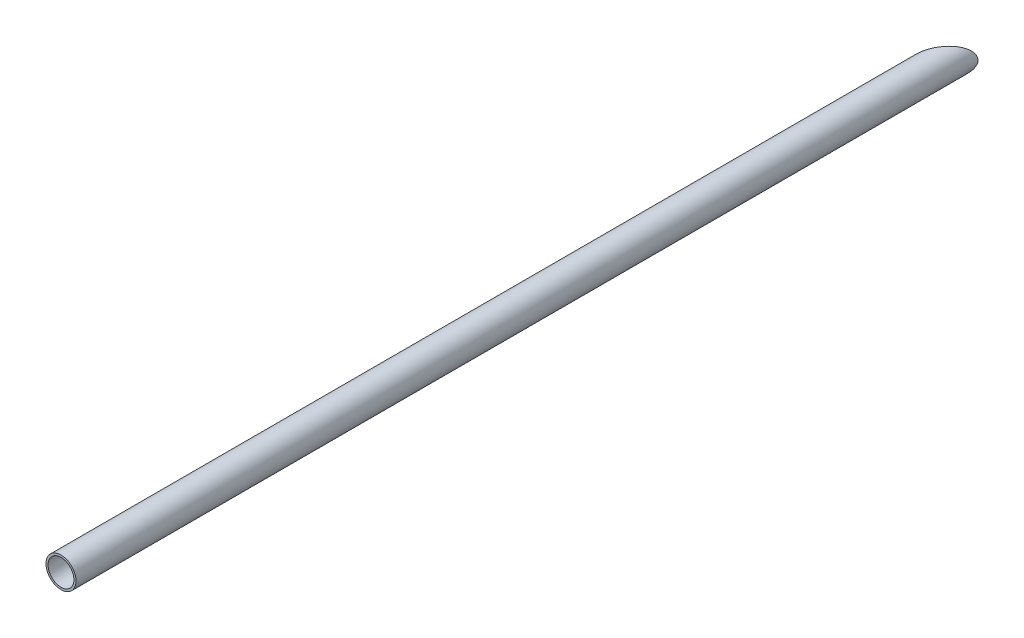
ISO-10303-21;
HEADER;
FILE_DESCRIPTION(('STEP AP214'),'2;1');
FILE_NAME('part.step','',(''),(''),'','','');
FILE_SCHEMA(('AUTOMOTIVE_DESIGN { 1 0 10303 214 1 1 1 1 }'));
ENDSEC;
DATA;
#1=APPLICATION_CONTEXT('core data for automotive mechanical design processes');
#2=APPLICATION_PROTOCOL_DEFINITION('international standard','automotive_design',2000,#1);
#3=PRODUCT_CONTEXT('',#1,'mechanical');
#4=PRODUCT('Part','Part','',(#3));
#5=PRODUCT_RELATED_PRODUCT_CATEGORY('part','',(#4));
#6=PRODUCT_DEFINITION_FORMATION('','',#4);
#7=PRODUCT_DEFINITION_CONTEXT('part definition',#1,'design');
#8=PRODUCT_DEFINITION('design','',#6,#7);
#9=PRODUCT_DEFINITION_SHAPE('','',#8);
#10=(LENGTH_UNIT() NAMED_UNIT(*) SI_UNIT(.MILLI.,.METRE.));
#11=(NAMED_UNIT(*) PLANE_ANGLE_UNIT() SI_UNIT($,.RADIAN.));
#12=(NAMED_UNIT(*) SI_UNIT($,.STERADIAN.) SOLID_ANGLE_UNIT());
#13=UNCERTAINTY_MEASURE_WITH_UNIT(LENGTH_MEASURE(1.E-05),#10,'distance_accuracy_value','');
#14=(GEOMETRIC_REPRESENTATION_CONTEXT(3) GLOBAL_UNCERTAINTY_ASSIGNED_CONTEXT((#13)) GLOBAL_UNIT_ASSIGNED_CONTEXT((#10,
#11,#12)) REPRESENTATION_CONTEXT('',''));
#15=CARTESIAN_POINT('',(0.,0.,0.));
#16=DIRECTION('',(0.,0.,1.));
#17=DIRECTION('',(1.,0.,0.));
#18=AXIS2_PLACEMENT_3D('',#15,#16,#17);
#19=CARTESIAN_POINT('',(0.,0.,762.));
#20=DIRECTION('',(0.,0.,1.));
#21=DIRECTION('',(1.,0.,0.));
#22=AXIS2_PLACEMENT_3D('',#19,#20,#21);
#23=PLANE('',#22);
#24=CARTESIAN_POINT('',(0.,0.,762.));
#25=DIRECTION('',(0.,0.,1.));
#26=DIRECTION('',(1.,0.,0.));
#27=AXIS2_PLACEMENT_3D('',#24,#25,#26);
#28=CIRCLE('',#27,12.7);
#29=CARTESIAN_POINT('',(12.7,0.,762.));
#30=VERTEX_POINT('',#29);
#31=EDGE_CURVE('E10',#30,#30,#28,.T.);
#32=ORIENTED_EDGE('',*,*,#31,.T.);
#33=EDGE_LOOP('',(#32));
#34=FACE_BOUND('',#33,.T.);
#35=CARTESIAN_POINT('',(0.,0.,762.));
#36=DIRECTION('',(0.,0.,1.));
#37=DIRECTION('',(1.,0.,0.));
#38=AXIS2_PLACEMENT_3D('',#35,#36,#37);
#39=CIRCLE('',#38,10.922);
#40=CARTESIAN_POINT('',(10.922,0.,762.));
#41=VERTEX_POINT('',#40);
#42=EDGE_CURVE('E48',#41,#41,#39,.T.);
#43=ORIENTED_EDGE('',*,*,#42,.F.);
#44=EDGE_LOOP('',(#43));
#45=FACE_BOUND('',#44,.T.);
#46=ADVANCED_FACE('F40',(#34,#45),#23,.T.);
#47=CARTESIAN_POINT('',(0.,0.,762.));
#48=DIRECTION('',(0.,0.,-1.));
#49=DIRECTION('',(-1.,0.,0.));
#50=AXIS2_PLACEMENT_3D('',#47,#48,#49);
#51=CYLINDRICAL_SURFACE('',#50,12.7);
#52=ORIENTED_EDGE('',*,*,#31,.F.);
#53=EDGE_LOOP('',(#52));
#54=FACE_BOUND('',#53,.T.);
#55=CARTESIAN_POINT('',(0.,0.,18.1374796856246));
#56=DIRECTION('',(0.819152044288989,0.,0.57357643635105));
#57=DIRECTION('',(0.57357643635105,0.,-0.819152044288989));
#58=AXIS2_PLACEMENT_3D('',#55,#56,#57);
#59=ELLIPSE('',#58,22.1417743043878,12.7);
#60=CARTESIAN_POINT('',(12.7,0.,0.));
#61=VERTEX_POINT('',#60);
#62=EDGE_CURVE('E52',#61,#61,#59,.T.);
#63=ORIENTED_EDGE('',*,*,#62,.T.);
#64=EDGE_LOOP('',(#63));
#65=FACE_BOUND('',#64,.T.);
#66=ADVANCED_FACE('F42',(#54,#65),#51,.T.);
#67=CARTESIAN_POINT('',(0.,0.,762.));
#68=DIRECTION('',(0.,0.,-1.));
#69=DIRECTION('',(-1.,0.,0.));
#70=AXIS2_PLACEMENT_3D('',#67,#68,#69);
#71=CYLINDRICAL_SURFACE('',#70,10.922);
#72=CARTESIAN_POINT('',(0.,0.,18.1374796856246));
#73=DIRECTION('',(0.819152044288989,0.,0.57357643635105));
#74=DIRECTION('',(0.57357643635105,0.,-0.819152044288989));
#75=AXIS2_PLACEMENT_3D('',#72,#73,#74);
#76=ELLIPSE('',#75,19.0419259017735,10.922);
#77=CARTESIAN_POINT('',(10.922,0.,2.53924715598742));
#78=VERTEX_POINT('',#77);
#79=EDGE_CURVE('E44',#78,#78,#76,.T.);
#80=ORIENTED_EDGE('',*,*,#79,.F.);
#81=EDGE_LOOP('',(#80));
#82=FACE_BOUND('',#81,.T.);
#83=ORIENTED_EDGE('',*,*,#42,.T.);
#84=EDGE_LOOP('',(#83));
#85=FACE_BOUND('',#84,.T.);
#86=ADVANCED_FACE('F64',(#82,#85),#71,.F.);
#87=CARTESIAN_POINT('',(12.7,-12.7,0.));
#88=DIRECTION('',(0.819152044288989,0.,0.57357643635105));
#89=DIRECTION('',(0.57357643635105,0.,-0.819152044288989));
#90=AXIS2_PLACEMENT_3D('',#87,#88,#89);
#91=PLANE('',#90);
#92=ORIENTED_EDGE('',*,*,#79,.T.);
#93=EDGE_LOOP('',(#92));
#94=FACE_BOUND('',#93,.T.);
#95=ORIENTED_EDGE('',*,*,#62,.F.);
#96=EDGE_LOOP('',(#95));
#97=FACE_BOUND('',#96,.T.);
#98=ADVANCED_FACE('F61',(#94,#97),#91,.F.);
#99=CLOSED_SHELL('',(#46,#66,#86,#98));
#100=MANIFOLD_SOLID_BREP('B2',#99);
#101=ADVANCED_BREP_SHAPE_REPRESENTATION('',(#18,#100),#14);
#102=SHAPE_DEFINITION_REPRESENTATION(#9,#101);
ENDSEC;
END-ISO-10303-21;
